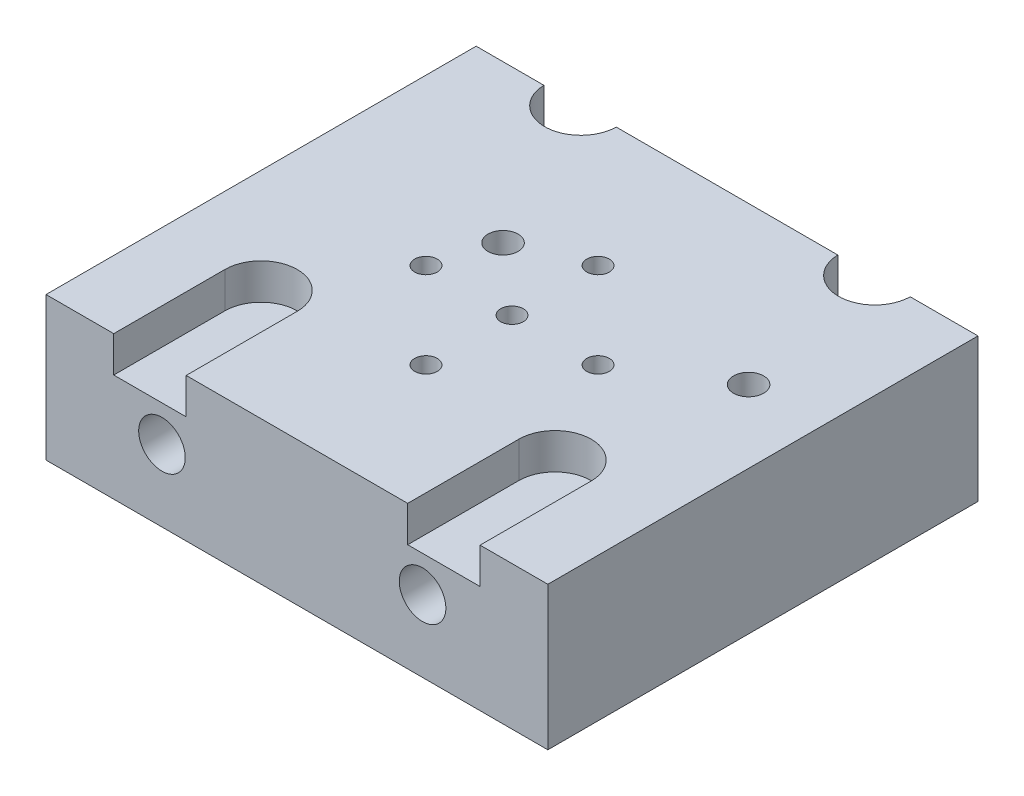
ISO-10303-21;
HEADER;
FILE_DESCRIPTION(('STEP AP214'),'2;1');
FILE_NAME('part.step','',(''),(''),'','','');
FILE_SCHEMA(('AUTOMOTIVE_DESIGN { 1 0 10303 214 1 1 1 1 }'));
ENDSEC;
DATA;
#1=APPLICATION_CONTEXT('core data for automotive mechanical design processes');
#2=APPLICATION_PROTOCOL_DEFINITION('international standard','automotive_design',2000,#1);
#3=PRODUCT_CONTEXT('',#1,'mechanical');
#4=PRODUCT('Part','Part','',(#3));
#5=PRODUCT_RELATED_PRODUCT_CATEGORY('part','',(#4));
#6=PRODUCT_DEFINITION_FORMATION('','',#4);
#7=PRODUCT_DEFINITION_CONTEXT('part definition',#1,'design');
#8=PRODUCT_DEFINITION('design','',#6,#7);
#9=PRODUCT_DEFINITION_SHAPE('','',#8);
#10=(LENGTH_UNIT() NAMED_UNIT(*) SI_UNIT(.MILLI.,.METRE.));
#11=(NAMED_UNIT(*) PLANE_ANGLE_UNIT() SI_UNIT($,.RADIAN.));
#12=(NAMED_UNIT(*) SI_UNIT($,.STERADIAN.) SOLID_ANGLE_UNIT());
#13=UNCERTAINTY_MEASURE_WITH_UNIT(LENGTH_MEASURE(1.E-05),#10,'distance_accuracy_value','');
#14=(GEOMETRIC_REPRESENTATION_CONTEXT(3) GLOBAL_UNCERTAINTY_ASSIGNED_CONTEXT((#13)) GLOBAL_UNIT_ASSIGNED_CONTEXT((#10,
#11,#12)) REPRESENTATION_CONTEXT('',''));
#15=CARTESIAN_POINT('',(0.,0.,0.));
#16=DIRECTION('',(0.,0.,1.));
#17=DIRECTION('',(1.,0.,0.));
#18=AXIS2_PLACEMENT_3D('',#15,#16,#17);
#19=CARTESIAN_POINT('',(35.,0.,30.));
#20=DIRECTION('',(0.,1.,0.));
#21=DIRECTION('',(0.,0.,1.));
#22=AXIS2_PLACEMENT_3D('',#19,#20,#21);
#23=CYLINDRICAL_SURFACE('',#22,1.575);
#24=CARTESIAN_POINT('',(35.,20.,30.));
#25=DIRECTION('',(0.,1.,0.));
#26=DIRECTION('',(0.,0.,1.));
#27=AXIS2_PLACEMENT_3D('',#24,#25,#26);
#28=CIRCLE('',#27,1.575);
#29=CARTESIAN_POINT('',(35.,20.,31.575));
#30=VERTEX_POINT('',#29);
#31=EDGE_CURVE('E296',#30,#30,#28,.T.);
#32=ORIENTED_EDGE('',*,*,#31,.T.);
#33=EDGE_LOOP('',(#32));
#34=FACE_BOUND('',#33,.T.);
#35=CARTESIAN_POINT('',(35.,3.,30.));
#36=DIRECTION('',(0.,-1.,0.));
#37=DIRECTION('',(0.,0.,-1.));
#38=AXIS2_PLACEMENT_3D('',#35,#36,#37);
#39=CIRCLE('',#38,1.575);
#40=CARTESIAN_POINT('',(35.,3.,28.425));
#41=VERTEX_POINT('',#40);
#42=EDGE_CURVE('E274',#41,#41,#39,.F.);
#43=ORIENTED_EDGE('',*,*,#42,.F.);
#44=EDGE_LOOP('',(#43));
#45=FACE_BOUND('',#44,.T.);
#46=ADVANCED_FACE('F47',(#34,#45),#23,.F.);
#47=CARTESIAN_POINT('',(23.,0.,30.));
#48=DIRECTION('',(0.,1.,0.));
#49=DIRECTION('',(0.,0.,1.));
#50=AXIS2_PLACEMENT_3D('',#47,#48,#49);
#51=CYLINDRICAL_SURFACE('',#50,1.575);
#52=CARTESIAN_POINT('',(23.,20.,30.));
#53=DIRECTION('',(0.,1.,0.));
#54=DIRECTION('',(0.,0.,1.));
#55=AXIS2_PLACEMENT_3D('',#52,#53,#54);
#56=CIRCLE('',#55,1.575);
#57=CARTESIAN_POINT('',(23.,20.,31.575));
#58=VERTEX_POINT('',#57);
#59=EDGE_CURVE('E278',#58,#58,#56,.T.);
#60=ORIENTED_EDGE('',*,*,#59,.T.);
#61=EDGE_LOOP('',(#60));
#62=FACE_BOUND('',#61,.T.);
#63=CARTESIAN_POINT('',(23.,3.,30.));
#64=DIRECTION('',(0.,-1.,0.));
#65=DIRECTION('',(0.,0.,-1.));
#66=AXIS2_PLACEMENT_3D('',#63,#64,#65);
#67=CIRCLE('',#66,1.575);
#68=CARTESIAN_POINT('',(23.,3.,28.425));
#69=VERTEX_POINT('',#68);
#70=EDGE_CURVE('E345',#69,#69,#67,.F.);
#71=ORIENTED_EDGE('',*,*,#70,.F.);
#72=EDGE_LOOP('',(#71));
#73=FACE_BOUND('',#72,.T.);
#74=ADVANCED_FACE('F424',(#62,#73),#51,.F.);
#75=CARTESIAN_POINT('',(35.,0.,42.));
#76=DIRECTION('',(0.,1.,0.));
#77=DIRECTION('',(0.,0.,1.));
#78=AXIS2_PLACEMENT_3D('',#75,#76,#77);
#79=CYLINDRICAL_SURFACE('',#78,1.57499999999999);
#80=CARTESIAN_POINT('',(35.,20.,42.));
#81=DIRECTION('',(0.,1.,0.));
#82=DIRECTION('',(0.,0.,1.));
#83=AXIS2_PLACEMENT_3D('',#80,#81,#82);
#84=CIRCLE('',#83,1.57499999999999);
#85=CARTESIAN_POINT('',(35.,20.,43.575));
#86=VERTEX_POINT('',#85);
#87=EDGE_CURVE('E287',#86,#86,#84,.T.);
#88=ORIENTED_EDGE('',*,*,#87,.T.);
#89=EDGE_LOOP('',(#88));
#90=FACE_BOUND('',#89,.T.);
#91=CARTESIAN_POINT('',(35.,3.,42.));
#92=DIRECTION('',(0.,-1.,0.));
#93=DIRECTION('',(0.,0.,-1.));
#94=AXIS2_PLACEMENT_3D('',#91,#92,#93);
#95=CIRCLE('',#94,1.57499999999999);
#96=CARTESIAN_POINT('',(35.,3.,40.425));
#97=VERTEX_POINT('',#96);
#98=EDGE_CURVE('E342',#97,#97,#95,.F.);
#99=ORIENTED_EDGE('',*,*,#98,.F.);
#100=EDGE_LOOP('',(#99));
#101=FACE_BOUND('',#100,.T.);
#102=ADVANCED_FACE('F431',(#90,#101),#79,.F.);
#103=CARTESIAN_POINT('',(47.,0.,30.));
#104=DIRECTION('',(0.,1.,0.));
#105=DIRECTION('',(0.,0.,1.));
#106=AXIS2_PLACEMENT_3D('',#103,#104,#105);
#107=CYLINDRICAL_SURFACE('',#106,1.575);
#108=CARTESIAN_POINT('',(47.,20.,30.));
#109=DIRECTION('',(0.,1.,0.));
#110=DIRECTION('',(0.,0.,1.));
#111=AXIS2_PLACEMENT_3D('',#108,#109,#110);
#112=CIRCLE('',#111,1.575);
#113=CARTESIAN_POINT('',(47.,20.,31.575));
#114=VERTEX_POINT('',#113);
#115=EDGE_CURVE('E290',#114,#114,#112,.T.);
#116=ORIENTED_EDGE('',*,*,#115,.T.);
#117=EDGE_LOOP('',(#116));
#118=FACE_BOUND('',#117,.T.);
#119=CARTESIAN_POINT('',(47.,3.,30.));
#120=DIRECTION('',(0.,-1.,0.));
#121=DIRECTION('',(0.,0.,-1.));
#122=AXIS2_PLACEMENT_3D('',#119,#120,#121);
#123=CIRCLE('',#122,1.575);
#124=CARTESIAN_POINT('',(47.,3.,28.425));
#125=VERTEX_POINT('',#124);
#126=EDGE_CURVE('E339',#125,#125,#123,.F.);
#127=ORIENTED_EDGE('',*,*,#126,.F.);
#128=EDGE_LOOP('',(#127));
#129=FACE_BOUND('',#128,.T.);
#130=ADVANCED_FACE('F437',(#118,#129),#107,.F.);
#131=CARTESIAN_POINT('',(35.,0.,18.));
#132=DIRECTION('',(0.,1.,0.));
#133=DIRECTION('',(0.,0.,1.));
#134=AXIS2_PLACEMENT_3D('',#131,#132,#133);
#135=CYLINDRICAL_SURFACE('',#134,1.575);
#136=CARTESIAN_POINT('',(35.,20.,18.));
#137=DIRECTION('',(0.,1.,0.));
#138=DIRECTION('',(0.,0.,1.));
#139=AXIS2_PLACEMENT_3D('',#136,#137,#138);
#140=CIRCLE('',#139,1.575);
#141=CARTESIAN_POINT('',(35.,20.,19.575));
#142=VERTEX_POINT('',#141);
#143=EDGE_CURVE('E293',#142,#142,#140,.T.);
#144=ORIENTED_EDGE('',*,*,#143,.T.);
#145=EDGE_LOOP('',(#144));
#146=FACE_BOUND('',#145,.T.);
#147=CARTESIAN_POINT('',(35.,3.,18.));
#148=DIRECTION('',(0.,-1.,0.));
#149=DIRECTION('',(0.,0.,-1.));
#150=AXIS2_PLACEMENT_3D('',#147,#148,#149);
#151=CIRCLE('',#150,1.575);
#152=CARTESIAN_POINT('',(35.,3.,16.425));
#153=VERTEX_POINT('',#152);
#154=EDGE_CURVE('E240',#153,#153,#151,.F.);
#155=ORIENTED_EDGE('',*,*,#154,.F.);
#156=EDGE_LOOP('',(#155));
#157=FACE_BOUND('',#156,.T.);
#158=ADVANCED_FACE('F455',(#146,#157),#135,.F.);
#159=CARTESIAN_POINT('',(0.,20.,0.));
#160=DIRECTION('',(1.,0.,0.));
#161=DIRECTION('',(0.,0.,-1.));
#162=AXIS2_PLACEMENT_3D('',#159,#160,#161);
#163=PLANE('',#162);
#164=DIRECTION('',(0.,0.,1.));
#165=VECTOR('',#164,1.);
#166=CARTESIAN_POINT('',(0.,0.,0.));
#167=LINE('',#166,#165);
#168=CARTESIAN_POINT('',(0.,0.,0.));
#169=VERTEX_POINT('',#168);
#170=CARTESIAN_POINT('',(0.,0.,60.));
#171=VERTEX_POINT('',#170);
#172=EDGE_CURVE('E301',#169,#171,#167,.T.);
#173=ORIENTED_EDGE('',*,*,#172,.T.);
#174=DIRECTION('',(0.,-1.,0.));
#175=VECTOR('',#174,1.);
#176=CARTESIAN_POINT('',(0.,20.,60.));
#177=LINE('',#176,#175);
#178=CARTESIAN_POINT('',(0.,20.,60.));
#179=VERTEX_POINT('',#178);
#180=EDGE_CURVE('E333',#179,#171,#177,.T.);
#181=ORIENTED_EDGE('',*,*,#180,.F.);
#182=DIRECTION('',(0.,0.,1.));
#183=VECTOR('',#182,1.);
#184=CARTESIAN_POINT('',(0.,20.,0.));
#185=LINE('',#184,#183);
#186=CARTESIAN_POINT('',(0.,20.,0.));
#187=VERTEX_POINT('',#186);
#188=EDGE_CURVE('E302',#187,#179,#185,.T.);
#189=ORIENTED_EDGE('',*,*,#188,.F.);
#190=DIRECTION('',(0.,-1.,0.));
#191=VECTOR('',#190,1.);
#192=CARTESIAN_POINT('',(0.,20.,0.));
#193=LINE('',#192,#191);
#194=EDGE_CURVE('E316',#187,#169,#193,.T.);
#195=ORIENTED_EDGE('',*,*,#194,.T.);
#196=EDGE_LOOP('',(#173,#181,#189,#195));
#197=FACE_BOUND('',#196,.T.);
#198=ADVANCED_FACE('F404',(#197),#163,.F.);
#199=CARTESIAN_POINT('',(0.,20.,60.));
#200=DIRECTION('',(0.,0.,-1.));
#201=DIRECTION('',(-1.,0.,0.));
#202=AXIS2_PLACEMENT_3D('',#199,#200,#201);
#203=PLANE('',#202);
#204=CARTESIAN_POINT('',(52.525,10.,60.));
#205=DIRECTION('',(0.,0.,-1.));
#206=DIRECTION('',(-1.,0.,0.));
#207=AXIS2_PLACEMENT_3D('',#204,#205,#206);
#208=CIRCLE('',#207,3.25);
#209=CARTESIAN_POINT('',(49.275,10.,60.));
#210=VERTEX_POINT('',#209);
#211=EDGE_CURVE('E267',#210,#210,#208,.T.);
#212=ORIENTED_EDGE('',*,*,#211,.T.);
#213=EDGE_LOOP('',(#212));
#214=FACE_BOUND('',#213,.T.);
#215=CARTESIAN_POINT('',(16.175,10.,60.));
#216=DIRECTION('',(0.,0.,-1.));
#217=DIRECTION('',(-1.,0.,0.));
#218=AXIS2_PLACEMENT_3D('',#215,#216,#217);
#219=CIRCLE('',#218,3.25);
#220=CARTESIAN_POINT('',(12.925,10.,60.));
#221=VERTEX_POINT('',#220);
#222=EDGE_CURVE('E271',#221,#221,#219,.T.);
#223=ORIENTED_EDGE('',*,*,#222,.T.);
#224=EDGE_LOOP('',(#223));
#225=FACE_BOUND('',#224,.T.);
#226=DIRECTION('',(-1.,0.,0.));
#227=VECTOR('',#226,1.);
#228=CARTESIAN_POINT('',(0.,15.,60.));
#229=LINE('',#228,#227);
#230=CARTESIAN_POINT('',(60.55,15.,60.));
#231=VERTEX_POINT('',#230);
#232=CARTESIAN_POINT('',(50.45,15.,60.));
#233=VERTEX_POINT('',#232);
#234=EDGE_CURVE('E12',#231,#233,#229,.T.);
#235=ORIENTED_EDGE('',*,*,#234,.T.);
#236=DIRECTION('',(0.,1.,0.));
#237=VECTOR('',#236,1.);
#238=CARTESIAN_POINT('',(50.45,20.,60.));
#239=LINE('',#238,#237);
#240=CARTESIAN_POINT('',(50.45,20.,60.));
#241=VERTEX_POINT('',#240);
#242=EDGE_CURVE('E230',#233,#241,#239,.T.);
#243=ORIENTED_EDGE('',*,*,#242,.T.);
#244=DIRECTION('',(1.,0.,0.));
#245=VECTOR('',#244,1.);
#246=CARTESIAN_POINT('',(0.,20.,60.));
#247=LINE('',#246,#245);
#248=CARTESIAN_POINT('',(19.55,20.,60.));
#249=VERTEX_POINT('',#248);
#250=EDGE_CURVE('E190',#249,#241,#247,.T.);
#251=ORIENTED_EDGE('',*,*,#250,.F.);
#252=DIRECTION('',(0.,-1.,0.));
#253=VECTOR('',#252,1.);
#254=CARTESIAN_POINT('',(19.55,20.,60.));
#255=LINE('',#254,#253);
#256=CARTESIAN_POINT('',(19.55,15.,60.));
#257=VERTEX_POINT('',#256);
#258=EDGE_CURVE('E215',#249,#257,#255,.T.);
#259=ORIENTED_EDGE('',*,*,#258,.T.);
#260=DIRECTION('',(1.,0.,0.));
#261=VECTOR('',#260,1.);
#262=CARTESIAN_POINT('',(0.,15.,60.));
#263=LINE('',#262,#261);
#264=CARTESIAN_POINT('',(9.45000000000001,15.,60.));
#265=VERTEX_POINT('',#264);
#266=EDGE_CURVE('E56',#265,#257,#263,.T.);
#267=ORIENTED_EDGE('',*,*,#266,.F.);
#268=DIRECTION('',(0.,1.,0.));
#269=VECTOR('',#268,1.);
#270=CARTESIAN_POINT('',(9.45000000000001,20.,60.));
#271=LINE('',#270,#269);
#272=CARTESIAN_POINT('',(9.45000000000001,20.,60.));
#273=VERTEX_POINT('',#272);
#274=EDGE_CURVE('E220',#265,#273,#271,.T.);
#275=ORIENTED_EDGE('',*,*,#274,.T.);
#276=EDGE_CURVE('E307',#179,#273,#247,.T.);
#277=ORIENTED_EDGE('',*,*,#276,.F.);
#278=ORIENTED_EDGE('',*,*,#180,.T.);
#279=DIRECTION('',(1.,0.,0.));
#280=VECTOR('',#279,1.);
#281=CARTESIAN_POINT('',(0.,0.,60.));
#282=LINE('',#281,#280);
#283=CARTESIAN_POINT('',(70.,0.,60.));
#284=VERTEX_POINT('',#283);
#285=EDGE_CURVE('E320',#171,#284,#282,.T.);
#286=ORIENTED_EDGE('',*,*,#285,.T.);
#287=DIRECTION('',(0.,-1.,0.));
#288=VECTOR('',#287,1.);
#289=CARTESIAN_POINT('',(70.,20.,60.));
#290=LINE('',#289,#288);
#291=CARTESIAN_POINT('',(70.,20.,60.));
#292=VERTEX_POINT('',#291);
#293=EDGE_CURVE('E330',#292,#284,#290,.T.);
#294=ORIENTED_EDGE('',*,*,#293,.F.);
#295=CARTESIAN_POINT('',(60.55,20.,60.));
#296=VERTEX_POINT('',#295);
#297=EDGE_CURVE('E305',#296,#292,#247,.T.);
#298=ORIENTED_EDGE('',*,*,#297,.F.);
#299=DIRECTION('',(0.,-1.,0.));
#300=VECTOR('',#299,1.);
#301=CARTESIAN_POINT('',(60.55,20.,60.));
#302=LINE('',#301,#300);
#303=EDGE_CURVE('E227',#296,#231,#302,.T.);
#304=ORIENTED_EDGE('',*,*,#303,.T.);
#305=EDGE_LOOP('',(#235,#243,#251,#259,#267,#275,#277,#278,#286,#294,#298,#304));
#306=FACE_BOUND('',#305,.T.);
#307=ADVANCED_FACE('F381',(#214,#225,#306),#203,.F.);
#308=CARTESIAN_POINT('',(70.,20.,0.));
#309=DIRECTION('',(-1.,0.,0.));
#310=DIRECTION('',(0.,0.,1.));
#311=AXIS2_PLACEMENT_3D('',#308,#309,#310);
#312=PLANE('',#311);
#313=DIRECTION('',(0.,0.,-1.));
#314=VECTOR('',#313,1.);
#315=CARTESIAN_POINT('',(70.,0.,0.));
#316=LINE('',#315,#314);
#317=CARTESIAN_POINT('',(70.,0.,0.));
#318=VERTEX_POINT('',#317);
#319=EDGE_CURVE('E322',#284,#318,#316,.T.);
#320=ORIENTED_EDGE('',*,*,#319,.T.);
#321=DIRECTION('',(0.,-1.,0.));
#322=VECTOR('',#321,1.);
#323=CARTESIAN_POINT('',(70.,20.,0.));
#324=LINE('',#323,#322);
#325=CARTESIAN_POINT('',(70.,20.,0.));
#326=VERTEX_POINT('',#325);
#327=EDGE_CURVE('E327',#326,#318,#324,.T.);
#328=ORIENTED_EDGE('',*,*,#327,.F.);
#329=DIRECTION('',(0.,0.,-1.));
#330=VECTOR('',#329,1.);
#331=CARTESIAN_POINT('',(70.,20.,0.));
#332=LINE('',#331,#330);
#333=EDGE_CURVE('E310',#292,#326,#332,.T.);
#334=ORIENTED_EDGE('',*,*,#333,.F.);
#335=ORIENTED_EDGE('',*,*,#293,.T.);
#336=EDGE_LOOP('',(#320,#328,#334,#335));
#337=FACE_BOUND('',#336,.T.);
#338=ADVANCED_FACE('F388',(#337),#312,.F.);
#339=CARTESIAN_POINT('',(0.,20.,0.));
#340=DIRECTION('',(0.,0.,1.));
#341=DIRECTION('',(1.,0.,0.));
#342=AXIS2_PLACEMENT_3D('',#339,#340,#341);
#343=PLANE('',#342);
#344=CARTESIAN_POINT('',(52.525,10.,0.));
#345=DIRECTION('',(0.,0.,1.));
#346=DIRECTION('',(1.,0.,0.));
#347=AXIS2_PLACEMENT_3D('',#344,#345,#346);
#348=CIRCLE('',#347,4.05);
#349=CARTESIAN_POINT('',(56.575,10.,0.));
#350=VERTEX_POINT('',#349);
#351=EDGE_CURVE('E355',#350,#350,#348,.T.);
#352=ORIENTED_EDGE('',*,*,#351,.T.);
#353=EDGE_LOOP('',(#352));
#354=FACE_BOUND('',#353,.T.);
#355=CARTESIAN_POINT('',(16.175,10.,0.));
#356=DIRECTION('',(0.,0.,1.));
#357=DIRECTION('',(1.,0.,0.));
#358=AXIS2_PLACEMENT_3D('',#355,#356,#357);
#359=CIRCLE('',#358,4.05);
#360=CARTESIAN_POINT('',(20.225,10.,0.));
#361=VERTEX_POINT('',#360);
#362=EDGE_CURVE('E352',#361,#361,#359,.T.);
#363=ORIENTED_EDGE('',*,*,#362,.T.);
#364=EDGE_LOOP('',(#363));
#365=FACE_BOUND('',#364,.T.);
#366=DIRECTION('',(-1.,0.,0.));
#367=VECTOR('',#366,1.);
#368=CARTESIAN_POINT('',(0.,15.,0.));
#369=LINE('',#368,#367);
#370=CARTESIAN_POINT('',(19.5489093426721,15.,0.));
#371=VERTEX_POINT('',#370);
#372=CARTESIAN_POINT('',(9.45109065732797,15.,0.));
#373=VERTEX_POINT('',#372);
#374=EDGE_CURVE('E370',#371,#373,#369,.T.);
#375=ORIENTED_EDGE('',*,*,#374,.F.);
#376=DIRECTION('',(0.,1.,0.));
#377=VECTOR('',#376,1.);
#378=CARTESIAN_POINT('',(19.5489093426721,15.,0.));
#379=LINE('',#378,#377);
#380=CARTESIAN_POINT('',(19.5489093426721,20.,0.));
#381=VERTEX_POINT('',#380);
#382=EDGE_CURVE('E233',#371,#381,#379,.T.);
#383=ORIENTED_EDGE('',*,*,#382,.T.);
#384=DIRECTION('',(-1.,0.,0.));
#385=VECTOR('',#384,1.);
#386=CARTESIAN_POINT('',(0.,20.,0.));
#387=LINE('',#386,#385);
#388=CARTESIAN_POINT('',(50.451090657328,20.,0.));
#389=VERTEX_POINT('',#388);
#390=EDGE_CURVE('E317',#389,#381,#387,.T.);
#391=ORIENTED_EDGE('',*,*,#390,.F.);
#392=DIRECTION('',(0.,1.,0.));
#393=VECTOR('',#392,1.);
#394=CARTESIAN_POINT('',(50.451090657328,15.,0.));
#395=LINE('',#394,#393);
#396=CARTESIAN_POINT('',(50.451090657328,15.,0.));
#397=VERTEX_POINT('',#396);
#398=EDGE_CURVE('E71',#389,#397,#395,.F.);
#399=ORIENTED_EDGE('',*,*,#398,.T.);
#400=DIRECTION('',(1.,0.,0.));
#401=VECTOR('',#400,1.);
#402=CARTESIAN_POINT('',(0.,15.,0.));
#403=LINE('',#402,#401);
#404=CARTESIAN_POINT('',(60.548909342672,15.,0.));
#405=VERTEX_POINT('',#404);
#406=EDGE_CURVE('E367',#397,#405,#403,.T.);
#407=ORIENTED_EDGE('',*,*,#406,.T.);
#408=DIRECTION('',(0.,1.,0.));
#409=VECTOR('',#408,1.);
#410=CARTESIAN_POINT('',(60.548909342672,15.,0.));
#411=LINE('',#410,#409);
#412=CARTESIAN_POINT('',(60.548909342672,20.,0.));
#413=VERTEX_POINT('',#412);
#414=EDGE_CURVE('E224',#405,#413,#411,.T.);
#415=ORIENTED_EDGE('',*,*,#414,.T.);
#416=EDGE_CURVE('E313',#326,#413,#387,.T.);
#417=ORIENTED_EDGE('',*,*,#416,.F.);
#418=ORIENTED_EDGE('',*,*,#327,.T.);
#419=DIRECTION('',(-1.,0.,0.));
#420=VECTOR('',#419,1.);
#421=CARTESIAN_POINT('',(0.,0.,0.));
#422=LINE('',#421,#420);
#423=EDGE_CURVE('E306',#318,#169,#422,.T.);
#424=ORIENTED_EDGE('',*,*,#423,.T.);
#425=ORIENTED_EDGE('',*,*,#194,.F.);
#426=CARTESIAN_POINT('',(9.45109065732797,20.,0.));
#427=VERTEX_POINT('',#426);
#428=EDGE_CURVE('E312',#427,#187,#387,.T.);
#429=ORIENTED_EDGE('',*,*,#428,.F.);
#430=DIRECTION('',(0.,1.,0.));
#431=VECTOR('',#430,1.);
#432=CARTESIAN_POINT('',(9.45109065732797,15.,0.));
#433=LINE('',#432,#431);
#434=EDGE_CURVE('E63',#427,#373,#433,.F.);
#435=ORIENTED_EDGE('',*,*,#434,.T.);
#436=EDGE_LOOP('',(#375,#383,#391,#399,#407,#415,#417,#418,#424,#425,#429,#435));
#437=FACE_BOUND('',#436,.T.);
#438=ADVANCED_FACE('F393',(#354,#365,#437),#343,.F.);
#439=CARTESIAN_POINT('',(0.,20.,0.));
#440=DIRECTION('',(0.,1.,0.));
#441=DIRECTION('',(0.,0.,1.));
#442=AXIS2_PLACEMENT_3D('',#439,#440,#441);
#443=PLANE('',#442);
#444=CARTESIAN_POINT('',(14.5,20.,-0.104949747398012));
#445=DIRECTION('',(0.,1.,0.));
#446=DIRECTION('',(0.,0.,1.));
#447=AXIS2_PLACEMENT_3D('',#444,#445,#446);
#448=CIRCLE('',#447,5.05);
#449=EDGE_CURVE('E365',#427,#381,#448,.T.);
#450=ORIENTED_EDGE('',*,*,#449,.F.);
#451=ORIENTED_EDGE('',*,*,#428,.T.);
#452=ORIENTED_EDGE('',*,*,#188,.T.);
#453=ORIENTED_EDGE('',*,*,#276,.T.);
#454=DIRECTION('',(0.,0.,1.));
#455=VECTOR('',#454,1.);
#456=CARTESIAN_POINT('',(9.45000000000001,20.,60.104949747398));
#457=LINE('',#456,#455);
#458=CARTESIAN_POINT('',(9.45000000000001,20.,44.5));
#459=VERTEX_POINT('',#458);
#460=EDGE_CURVE('E202',#459,#273,#457,.T.);
#461=ORIENTED_EDGE('',*,*,#460,.F.);
#462=CARTESIAN_POINT('',(14.5,20.,44.5));
#463=DIRECTION('',(0.,1.,0.));
#464=DIRECTION('',(0.,0.,1.));
#465=AXIS2_PLACEMENT_3D('',#462,#463,#464);
#466=CIRCLE('',#465,5.05);
#467=CARTESIAN_POINT('',(19.55,20.,44.5));
#468=VERTEX_POINT('',#467);
#469=EDGE_CURVE('E209',#468,#459,#466,.T.);
#470=ORIENTED_EDGE('',*,*,#469,.F.);
#471=DIRECTION('',(0.,0.,-1.));
#472=VECTOR('',#471,1.);
#473=CARTESIAN_POINT('',(19.5500000000001,20.,0.));
#474=LINE('',#473,#472);
#475=EDGE_CURVE('E361',#249,#468,#474,.T.);
#476=ORIENTED_EDGE('',*,*,#475,.F.);
#477=ORIENTED_EDGE('',*,*,#250,.T.);
#478=DIRECTION('',(0.,0.,1.));
#479=VECTOR('',#478,1.);
#480=CARTESIAN_POINT('',(50.45,20.,60.104949747398));
#481=LINE('',#480,#479);
#482=CARTESIAN_POINT('',(50.45,20.,44.5));
#483=VERTEX_POINT('',#482);
#484=EDGE_CURVE('E166',#483,#241,#481,.T.);
#485=ORIENTED_EDGE('',*,*,#484,.F.);
#486=CARTESIAN_POINT('',(55.5,20.,44.5));
#487=DIRECTION('',(0.,1.,0.));
#488=DIRECTION('',(0.,0.,-1.));
#489=AXIS2_PLACEMENT_3D('',#486,#487,#488);
#490=CIRCLE('',#489,5.05);
#491=CARTESIAN_POINT('',(60.55,20.,44.5));
#492=VERTEX_POINT('',#491);
#493=EDGE_CURVE('E178',#492,#483,#490,.T.);
#494=ORIENTED_EDGE('',*,*,#493,.F.);
#495=DIRECTION('',(0.,0.,-1.));
#496=VECTOR('',#495,1.);
#497=CARTESIAN_POINT('',(60.55,20.,0.));
#498=LINE('',#497,#496);
#499=EDGE_CURVE('E363',#296,#492,#498,.T.);
#500=ORIENTED_EDGE('',*,*,#499,.F.);
#501=ORIENTED_EDGE('',*,*,#297,.T.);
#502=ORIENTED_EDGE('',*,*,#333,.T.);
#503=ORIENTED_EDGE('',*,*,#416,.T.);
#504=CARTESIAN_POINT('',(55.5,20.,-0.104949747398012));
#505=DIRECTION('',(0.,1.,0.));
#506=DIRECTION('',(0.,0.,-1.));
#507=AXIS2_PLACEMENT_3D('',#504,#505,#506);
#508=CIRCLE('',#507,5.04999999999999);
#509=EDGE_CURVE('E174',#389,#413,#508,.T.);
#510=ORIENTED_EDGE('',*,*,#509,.F.);
#511=ORIENTED_EDGE('',*,*,#390,.T.);
#512=EDGE_LOOP('',(#450,#451,#452,#453,#461,#470,#476,#477,#485,#494,#500,#501,#502,#503,#510,#511));
#513=FACE_BOUND('',#512,.T.);
#514=CARTESIAN_POINT('',(59.875,20.,21.875));
#515=DIRECTION('',(0.,-1.,0.));
#516=DIRECTION('',(0.,0.,-1.));
#517=AXIS2_PLACEMENT_3D('',#514,#515,#516);
#518=CIRCLE('',#517,2.1);
#519=CARTESIAN_POINT('',(59.875,20.,19.775));
#520=VERTEX_POINT('',#519);
#521=EDGE_CURVE('E275',#520,#520,#518,.T.);
#522=ORIENTED_EDGE('',*,*,#521,.T.);
#523=EDGE_LOOP('',(#522));
#524=FACE_BOUND('',#523,.T.);
#525=CARTESIAN_POINT('',(25.625,20.,21.875));
#526=DIRECTION('',(0.,-1.,0.));
#527=DIRECTION('',(0.,0.,-1.));
#528=AXIS2_PLACEMENT_3D('',#525,#526,#527);
#529=CIRCLE('',#528,2.09999999999999);
#530=CARTESIAN_POINT('',(25.625,20.,19.775));
#531=VERTEX_POINT('',#530);
#532=EDGE_CURVE('E270',#531,#531,#529,.T.);
#533=ORIENTED_EDGE('',*,*,#532,.T.);
#534=EDGE_LOOP('',(#533));
#535=FACE_BOUND('',#534,.T.);
#536=ORIENTED_EDGE('',*,*,#143,.F.);
#537=EDGE_LOOP('',(#536));
#538=FACE_BOUND('',#537,.T.);
#539=ORIENTED_EDGE('',*,*,#115,.F.);
#540=EDGE_LOOP('',(#539));
#541=FACE_BOUND('',#540,.T.);
#542=ORIENTED_EDGE('',*,*,#87,.F.);
#543=EDGE_LOOP('',(#542));
#544=FACE_BOUND('',#543,.T.);
#545=ORIENTED_EDGE('',*,*,#59,.F.);
#546=EDGE_LOOP('',(#545));
#547=FACE_BOUND('',#546,.T.);
#548=ORIENTED_EDGE('',*,*,#31,.F.);
#549=EDGE_LOOP('',(#548));
#550=FACE_BOUND('',#549,.T.);
#551=ADVANCED_FACE('F186',(#513,#524,#535,#538,#541,#544,#547,#550),#443,.T.);
#552=CARTESIAN_POINT('',(0.,0.,0.));
#553=DIRECTION('',(0.,1.,0.));
#554=DIRECTION('',(0.,0.,1.));
#555=AXIS2_PLACEMENT_3D('',#552,#553,#554);
#556=PLANE('',#555);
#557=CARTESIAN_POINT('',(35.,0.,42.));
#558=DIRECTION('',(0.,-1.,0.));
#559=DIRECTION('',(0.,0.,-1.));
#560=AXIS2_PLACEMENT_3D('',#557,#558,#559);
#561=CIRCLE('',#560,2.99999999999999);
#562=CARTESIAN_POINT('',(35.,0.,39.));
#563=VERTEX_POINT('',#562);
#564=EDGE_CURVE('E241',#563,#563,#561,.T.);
#565=ORIENTED_EDGE('',*,*,#564,.F.);
#566=EDGE_LOOP('',(#565));
#567=FACE_BOUND('',#566,.T.);
#568=CARTESIAN_POINT('',(35.,0.,18.));
#569=DIRECTION('',(0.,-1.,0.));
#570=DIRECTION('',(0.,0.,-1.));
#571=AXIS2_PLACEMENT_3D('',#568,#569,#570);
#572=CIRCLE('',#571,2.99999999999999);
#573=CARTESIAN_POINT('',(35.,0.,15.));
#574=VERTEX_POINT('',#573);
#575=EDGE_CURVE('E252',#574,#574,#572,.T.);
#576=ORIENTED_EDGE('',*,*,#575,.F.);
#577=EDGE_LOOP('',(#576));
#578=FACE_BOUND('',#577,.T.);
#579=CARTESIAN_POINT('',(47.,0.,30.));
#580=DIRECTION('',(0.,-1.,0.));
#581=DIRECTION('',(0.,0.,-1.));
#582=AXIS2_PLACEMENT_3D('',#579,#580,#581);
#583=CIRCLE('',#582,2.99999999999999);
#584=CARTESIAN_POINT('',(47.,0.,27.));
#585=VERTEX_POINT('',#584);
#586=EDGE_CURVE('E245',#585,#585,#583,.T.);
#587=ORIENTED_EDGE('',*,*,#586,.F.);
#588=EDGE_LOOP('',(#587));
#589=FACE_BOUND('',#588,.T.);
#590=CARTESIAN_POINT('',(35.,0.,30.));
#591=DIRECTION('',(0.,-1.,0.));
#592=DIRECTION('',(0.,0.,-1.));
#593=AXIS2_PLACEMENT_3D('',#590,#591,#592);
#594=CIRCLE('',#593,2.99999999999999);
#595=CARTESIAN_POINT('',(35.,0.,27.));
#596=VERTEX_POINT('',#595);
#597=EDGE_CURVE('E262',#596,#596,#594,.T.);
#598=ORIENTED_EDGE('',*,*,#597,.F.);
#599=EDGE_LOOP('',(#598));
#600=FACE_BOUND('',#599,.T.);
#601=CARTESIAN_POINT('',(23.,0.,30.));
#602=DIRECTION('',(0.,-1.,0.));
#603=DIRECTION('',(0.,0.,-1.));
#604=AXIS2_PLACEMENT_3D('',#601,#602,#603);
#605=CIRCLE('',#604,3.);
#606=CARTESIAN_POINT('',(23.,0.,27.));
#607=VERTEX_POINT('',#606);
#608=EDGE_CURVE('E244',#607,#607,#605,.T.);
#609=ORIENTED_EDGE('',*,*,#608,.F.);
#610=EDGE_LOOP('',(#609));
#611=FACE_BOUND('',#610,.T.);
#612=CARTESIAN_POINT('',(59.875,0.,21.875));
#613=DIRECTION('',(0.,-1.,0.));
#614=DIRECTION('',(0.,0.,-1.));
#615=AXIS2_PLACEMENT_3D('',#612,#613,#614);
#616=CIRCLE('',#615,2.1);
#617=CARTESIAN_POINT('',(59.875,0.,19.775));
#618=VERTEX_POINT('',#617);
#619=EDGE_CURVE('E279',#618,#618,#616,.T.);
#620=ORIENTED_EDGE('',*,*,#619,.F.);
#621=EDGE_LOOP('',(#620));
#622=FACE_BOUND('',#621,.T.);
#623=CARTESIAN_POINT('',(25.625,0.,21.875));
#624=DIRECTION('',(0.,-1.,0.));
#625=DIRECTION('',(0.,0.,-1.));
#626=AXIS2_PLACEMENT_3D('',#623,#624,#625);
#627=CIRCLE('',#626,2.09999999999999);
#628=CARTESIAN_POINT('',(25.625,0.,19.775));
#629=VERTEX_POINT('',#628);
#630=EDGE_CURVE('E282',#629,#629,#627,.T.);
#631=ORIENTED_EDGE('',*,*,#630,.F.);
#632=EDGE_LOOP('',(#631));
#633=FACE_BOUND('',#632,.T.);
#634=ORIENTED_EDGE('',*,*,#172,.F.);
#635=ORIENTED_EDGE('',*,*,#423,.F.);
#636=ORIENTED_EDGE('',*,*,#319,.F.);
#637=ORIENTED_EDGE('',*,*,#285,.F.);
#638=EDGE_LOOP('',(#634,#635,#636,#637));
#639=FACE_BOUND('',#638,.T.);
#640=ADVANCED_FACE('F441',(#567,#578,#589,#600,#611,#622,#633,#639),#556,.F.);
#641=CARTESIAN_POINT('',(25.625,20.,21.875));
#642=DIRECTION('',(0.,-1.,0.));
#643=DIRECTION('',(0.,0.,-1.));
#644=AXIS2_PLACEMENT_3D('',#641,#642,#643);
#645=CYLINDRICAL_SURFACE('',#644,2.09999999999999);
#646=ORIENTED_EDGE('',*,*,#532,.F.);
#647=EDGE_LOOP('',(#646));
#648=FACE_BOUND('',#647,.T.);
#649=ORIENTED_EDGE('',*,*,#630,.T.);
#650=EDGE_LOOP('',(#649));
#651=FACE_BOUND('',#650,.T.);
#652=ADVANCED_FACE('F444',(#648,#651),#645,.F.);
#653=CARTESIAN_POINT('',(59.875,20.,21.875));
#654=DIRECTION('',(0.,-1.,0.));
#655=DIRECTION('',(0.,0.,-1.));
#656=AXIS2_PLACEMENT_3D('',#653,#654,#655);
#657=CYLINDRICAL_SURFACE('',#656,2.1);
#658=ORIENTED_EDGE('',*,*,#521,.F.);
#659=EDGE_LOOP('',(#658));
#660=FACE_BOUND('',#659,.T.);
#661=ORIENTED_EDGE('',*,*,#619,.T.);
#662=EDGE_LOOP('',(#661));
#663=FACE_BOUND('',#662,.T.);
#664=ADVANCED_FACE('F486',(#660,#663),#657,.F.);
#665=CARTESIAN_POINT('',(16.175,10.,60.));
#666=DIRECTION('',(0.,0.,-1.));
#667=DIRECTION('',(-1.,0.,0.));
#668=AXIS2_PLACEMENT_3D('',#665,#666,#667);
#669=CYLINDRICAL_SURFACE('',#668,3.25);
#670=CARTESIAN_POINT('',(16.175,10.,0.800000000000002));
#671=DIRECTION('',(0.,0.,1.));
#672=DIRECTION('',(1.,0.,0.));
#673=AXIS2_PLACEMENT_3D('',#670,#671,#672);
#674=CIRCLE('',#673,3.25);
#675=CARTESIAN_POINT('',(19.425,10.,0.800000000000002));
#676=VERTEX_POINT('',#675);
#677=EDGE_CURVE('E358',#676,#676,#674,.F.);
#678=ORIENTED_EDGE('',*,*,#677,.T.);
#679=EDGE_LOOP('',(#678));
#680=FACE_BOUND('',#679,.T.);
#681=ORIENTED_EDGE('',*,*,#222,.F.);
#682=EDGE_LOOP('',(#681));
#683=FACE_BOUND('',#682,.T.);
#684=ADVANCED_FACE('F479',(#680,#683),#669,.F.);
#685=CARTESIAN_POINT('',(52.525,10.,60.));
#686=DIRECTION('',(0.,0.,-1.));
#687=DIRECTION('',(-1.,0.,0.));
#688=AXIS2_PLACEMENT_3D('',#685,#686,#687);
#689=CYLINDRICAL_SURFACE('',#688,3.25);
#690=CARTESIAN_POINT('',(52.525,10.,0.800000000000009));
#691=DIRECTION('',(0.,0.,1.));
#692=DIRECTION('',(1.,0.,0.));
#693=AXIS2_PLACEMENT_3D('',#690,#691,#692);
#694=CIRCLE('',#693,3.25);
#695=CARTESIAN_POINT('',(55.775,10.,0.800000000000009));
#696=VERTEX_POINT('',#695);
#697=EDGE_CURVE('E336',#696,#696,#694,.F.);
#698=ORIENTED_EDGE('',*,*,#697,.T.);
#699=EDGE_LOOP('',(#698));
#700=FACE_BOUND('',#699,.T.);
#701=ORIENTED_EDGE('',*,*,#211,.F.);
#702=EDGE_LOOP('',(#701));
#703=FACE_BOUND('',#702,.T.);
#704=ADVANCED_FACE('F476',(#700,#703),#689,.F.);
#705=CARTESIAN_POINT('',(0.,3.,0.));
#706=DIRECTION('',(0.,-1.,0.));
#707=DIRECTION('',(0.,0.,-1.));
#708=AXIS2_PLACEMENT_3D('',#705,#706,#707);
#709=PLANE('',#708);
#710=CARTESIAN_POINT('',(35.,3.,18.));
#711=DIRECTION('',(0.,-1.,0.));
#712=DIRECTION('',(0.,0.,-1.));
#713=AXIS2_PLACEMENT_3D('',#710,#711,#712);
#714=CIRCLE('',#713,2.99999999999999);
#715=CARTESIAN_POINT('',(35.,3.,15.));
#716=VERTEX_POINT('',#715);
#717=EDGE_CURVE('E236',#716,#716,#714,.T.);
#718=ORIENTED_EDGE('',*,*,#717,.T.);
#719=EDGE_LOOP('',(#718));
#720=FACE_BOUND('',#719,.T.);
#721=ORIENTED_EDGE('',*,*,#154,.T.);
#722=EDGE_LOOP('',(#721));
#723=FACE_BOUND('',#722,.T.);
#724=ADVANCED_FACE('F478',(#720,#723),#709,.T.);
#725=CARTESIAN_POINT('',(35.,3.,18.));
#726=DIRECTION('',(0.,-1.,0.));
#727=DIRECTION('',(0.,0.,-1.));
#728=AXIS2_PLACEMENT_3D('',#725,#726,#727);
#729=CYLINDRICAL_SURFACE('',#728,2.99999999999999);
#730=ORIENTED_EDGE('',*,*,#717,.F.);
#731=EDGE_LOOP('',(#730));
#732=FACE_BOUND('',#731,.T.);
#733=ORIENTED_EDGE('',*,*,#575,.T.);
#734=EDGE_LOOP('',(#733));
#735=FACE_BOUND('',#734,.T.);
#736=ADVANCED_FACE('F511',(#732,#735),#729,.F.);
#737=CARTESIAN_POINT('',(0.,3.,0.));
#738=DIRECTION('',(0.,-1.,0.));
#739=DIRECTION('',(0.,0.,-1.));
#740=AXIS2_PLACEMENT_3D('',#737,#738,#739);
#741=PLANE('',#740);
#742=CARTESIAN_POINT('',(47.,3.,30.));
#743=DIRECTION('',(0.,-1.,0.));
#744=DIRECTION('',(0.,0.,-1.));
#745=AXIS2_PLACEMENT_3D('',#742,#743,#744);
#746=CIRCLE('',#745,2.99999999999999);
#747=CARTESIAN_POINT('',(47.,3.,27.));
#748=VERTEX_POINT('',#747);
#749=EDGE_CURVE('E249',#748,#748,#746,.T.);
#750=ORIENTED_EDGE('',*,*,#749,.T.);
#751=EDGE_LOOP('',(#750));
#752=FACE_BOUND('',#751,.T.);
#753=ORIENTED_EDGE('',*,*,#126,.T.);
#754=EDGE_LOOP('',(#753));
#755=FACE_BOUND('',#754,.T.);
#756=ADVANCED_FACE('F517',(#752,#755),#741,.T.);
#757=CARTESIAN_POINT('',(47.,3.,30.));
#758=DIRECTION('',(0.,-1.,0.));
#759=DIRECTION('',(0.,0.,-1.));
#760=AXIS2_PLACEMENT_3D('',#757,#758,#759);
#761=CYLINDRICAL_SURFACE('',#760,2.99999999999999);
#762=ORIENTED_EDGE('',*,*,#749,.F.);
#763=EDGE_LOOP('',(#762));
#764=FACE_BOUND('',#763,.T.);
#765=ORIENTED_EDGE('',*,*,#586,.T.);
#766=EDGE_LOOP('',(#765));
#767=FACE_BOUND('',#766,.T.);
#768=ADVANCED_FACE('F761',(#764,#767),#761,.F.);
#769=CARTESIAN_POINT('',(0.,3.,0.));
#770=DIRECTION('',(0.,-1.,0.));
#771=DIRECTION('',(0.,0.,-1.));
#772=AXIS2_PLACEMENT_3D('',#769,#770,#771);
#773=PLANE('',#772);
#774=CARTESIAN_POINT('',(35.,3.,42.));
#775=DIRECTION('',(0.,-1.,0.));
#776=DIRECTION('',(0.,0.,-1.));
#777=AXIS2_PLACEMENT_3D('',#774,#775,#776);
#778=CIRCLE('',#777,2.99999999999999);
#779=CARTESIAN_POINT('',(35.,3.,39.));
#780=VERTEX_POINT('',#779);
#781=EDGE_CURVE('E237',#780,#780,#778,.T.);
#782=ORIENTED_EDGE('',*,*,#781,.T.);
#783=EDGE_LOOP('',(#782));
#784=FACE_BOUND('',#783,.T.);
#785=ORIENTED_EDGE('',*,*,#98,.T.);
#786=EDGE_LOOP('',(#785));
#787=FACE_BOUND('',#786,.T.);
#788=ADVANCED_FACE('F770',(#784,#787),#773,.T.);
#789=CARTESIAN_POINT('',(35.,3.,42.));
#790=DIRECTION('',(0.,-1.,0.));
#791=DIRECTION('',(0.,0.,-1.));
#792=AXIS2_PLACEMENT_3D('',#789,#790,#791);
#793=CYLINDRICAL_SURFACE('',#792,2.99999999999999);
#794=ORIENTED_EDGE('',*,*,#781,.F.);
#795=EDGE_LOOP('',(#794));
#796=FACE_BOUND('',#795,.T.);
#797=ORIENTED_EDGE('',*,*,#564,.T.);
#798=EDGE_LOOP('',(#797));
#799=FACE_BOUND('',#798,.T.);
#800=ADVANCED_FACE('F528',(#796,#799),#793,.F.);
#801=CARTESIAN_POINT('',(0.,3.,0.));
#802=DIRECTION('',(0.,-1.,0.));
#803=DIRECTION('',(0.,0.,-1.));
#804=AXIS2_PLACEMENT_3D('',#801,#802,#803);
#805=PLANE('',#804);
#806=CARTESIAN_POINT('',(23.,3.,30.));
#807=DIRECTION('',(0.,-1.,0.));
#808=DIRECTION('',(0.,0.,-1.));
#809=AXIS2_PLACEMENT_3D('',#806,#807,#808);
#810=CIRCLE('',#809,3.);
#811=CARTESIAN_POINT('',(23.,3.,27.));
#812=VERTEX_POINT('',#811);
#813=EDGE_CURVE('E259',#812,#812,#810,.T.);
#814=ORIENTED_EDGE('',*,*,#813,.T.);
#815=EDGE_LOOP('',(#814));
#816=FACE_BOUND('',#815,.T.);
#817=ORIENTED_EDGE('',*,*,#70,.T.);
#818=EDGE_LOOP('',(#817));
#819=FACE_BOUND('',#818,.T.);
#820=ADVANCED_FACE('F525',(#816,#819),#805,.T.);
#821=CARTESIAN_POINT('',(23.,3.,30.));
#822=DIRECTION('',(0.,-1.,0.));
#823=DIRECTION('',(0.,0.,-1.));
#824=AXIS2_PLACEMENT_3D('',#821,#822,#823);
#825=CYLINDRICAL_SURFACE('',#824,3.);
#826=ORIENTED_EDGE('',*,*,#813,.F.);
#827=EDGE_LOOP('',(#826));
#828=FACE_BOUND('',#827,.T.);
#829=ORIENTED_EDGE('',*,*,#608,.T.);
#830=EDGE_LOOP('',(#829));
#831=FACE_BOUND('',#830,.T.);
#832=ADVANCED_FACE('F522',(#828,#831),#825,.F.);
#833=CARTESIAN_POINT('',(0.,3.,0.));
#834=DIRECTION('',(0.,-1.,0.));
#835=DIRECTION('',(0.,0.,-1.));
#836=AXIS2_PLACEMENT_3D('',#833,#834,#835);
#837=PLANE('',#836);
#838=CARTESIAN_POINT('',(35.,3.,30.));
#839=DIRECTION('',(0.,-1.,0.));
#840=DIRECTION('',(0.,0.,-1.));
#841=AXIS2_PLACEMENT_3D('',#838,#839,#840);
#842=CIRCLE('',#841,2.99999999999999);
#843=CARTESIAN_POINT('',(35.,3.,27.));
#844=VERTEX_POINT('',#843);
#845=EDGE_CURVE('E248',#844,#844,#842,.T.);
#846=ORIENTED_EDGE('',*,*,#845,.T.);
#847=EDGE_LOOP('',(#846));
#848=FACE_BOUND('',#847,.T.);
#849=ORIENTED_EDGE('',*,*,#42,.T.);
#850=EDGE_LOOP('',(#849));
#851=FACE_BOUND('',#850,.T.);
#852=ADVANCED_FACE('F469',(#848,#851),#837,.T.);
#853=CARTESIAN_POINT('',(35.,3.,30.));
#854=DIRECTION('',(0.,-1.,0.));
#855=DIRECTION('',(0.,0.,-1.));
#856=AXIS2_PLACEMENT_3D('',#853,#854,#855);
#857=CYLINDRICAL_SURFACE('',#856,2.99999999999999);
#858=ORIENTED_EDGE('',*,*,#845,.F.);
#859=EDGE_LOOP('',(#858));
#860=FACE_BOUND('',#859,.T.);
#861=ORIENTED_EDGE('',*,*,#597,.T.);
#862=EDGE_LOOP('',(#861));
#863=FACE_BOUND('',#862,.T.);
#864=ADVANCED_FACE('F461',(#860,#863),#857,.F.);
#865=CARTESIAN_POINT('',(52.525,10.,0.800000000000009));
#866=DIRECTION('',(0.,0.,-1.));
#867=DIRECTION('',(-1.,0.,0.));
#868=AXIS2_PLACEMENT_3D('',#865,#866,#867);
#869=CONICAL_SURFACE('',#868,3.25,0.785398163397441);
#870=ORIENTED_EDGE('',*,*,#351,.F.);
#871=EDGE_LOOP('',(#870));
#872=FACE_BOUND('',#871,.T.);
#873=ORIENTED_EDGE('',*,*,#697,.F.);
#874=EDGE_LOOP('',(#873));
#875=FACE_BOUND('',#874,.T.);
#876=ADVANCED_FACE('F457',(#872,#875),#869,.F.);
#877=CARTESIAN_POINT('',(16.175,10.,0.800000000000002));
#878=DIRECTION('',(0.,0.,-1.));
#879=DIRECTION('',(-1.,0.,0.));
#880=AXIS2_PLACEMENT_3D('',#877,#878,#879);
#881=CONICAL_SURFACE('',#880,3.25,0.785398163397443);
#882=ORIENTED_EDGE('',*,*,#362,.F.);
#883=EDGE_LOOP('',(#882));
#884=FACE_BOUND('',#883,.T.);
#885=ORIENTED_EDGE('',*,*,#677,.F.);
#886=EDGE_LOOP('',(#885));
#887=FACE_BOUND('',#886,.T.);
#888=ADVANCED_FACE('F50',(#884,#887),#881,.F.);
#889=CARTESIAN_POINT('',(14.5,15.,60.104949747398));
#890=DIRECTION('',(0.,1.,0.));
#891=DIRECTION('',(0.,0.,1.));
#892=AXIS2_PLACEMENT_3D('',#889,#890,#891);
#893=PLANE('',#892);
#894=ORIENTED_EDGE('',*,*,#266,.T.);
#895=DIRECTION('',(0.,0.,-1.));
#896=VECTOR('',#895,1.);
#897=CARTESIAN_POINT('',(19.55,15.,60.104949747398));
#898=LINE('',#897,#896);
#899=CARTESIAN_POINT('',(19.55,15.,44.5));
#900=VERTEX_POINT('',#899);
#901=EDGE_CURVE('E199',#257,#900,#898,.T.);
#902=ORIENTED_EDGE('',*,*,#901,.T.);
#903=CARTESIAN_POINT('',(14.5,15.,44.5));
#904=DIRECTION('',(0.,1.,0.));
#905=DIRECTION('',(0.,0.,1.));
#906=AXIS2_PLACEMENT_3D('',#903,#904,#905);
#907=CIRCLE('',#906,5.05);
#908=CARTESIAN_POINT('',(9.45000000000001,15.,44.5));
#909=VERTEX_POINT('',#908);
#910=EDGE_CURVE('E201',#900,#909,#907,.T.);
#911=ORIENTED_EDGE('',*,*,#910,.T.);
#912=DIRECTION('',(0.,0.,1.));
#913=VECTOR('',#912,1.);
#914=CARTESIAN_POINT('',(9.45000000000001,15.,60.104949747398));
#915=LINE('',#914,#913);
#916=EDGE_CURVE('E205',#909,#265,#915,.T.);
#917=ORIENTED_EDGE('',*,*,#916,.T.);
#918=EDGE_LOOP('',(#894,#902,#911,#917));
#919=FACE_BOUND('',#918,.T.);
#920=ADVANCED_FACE('F374',(#919),#893,.T.);
#921=CARTESIAN_POINT('',(9.45000000000001,15.,60.104949747398));
#922=DIRECTION('',(-1.,0.,0.));
#923=DIRECTION('',(0.,0.,1.));
#924=AXIS2_PLACEMENT_3D('',#921,#922,#923);
#925=PLANE('',#924);
#926=ORIENTED_EDGE('',*,*,#916,.F.);
#927=DIRECTION('',(0.,1.,0.));
#928=VECTOR('',#927,1.);
#929=CARTESIAN_POINT('',(9.45000000000001,15.,44.5));
#930=LINE('',#929,#928);
#931=EDGE_CURVE('E213',#909,#459,#930,.T.);
#932=ORIENTED_EDGE('',*,*,#931,.T.);
#933=ORIENTED_EDGE('',*,*,#460,.T.);
#934=ORIENTED_EDGE('',*,*,#274,.F.);
#935=EDGE_LOOP('',(#926,#932,#933,#934));
#936=FACE_BOUND('',#935,.T.);
#937=ADVANCED_FACE('F408',(#936),#925,.F.);
#938=CARTESIAN_POINT('',(19.55,15.,60.104949747398));
#939=DIRECTION('',(1.,0.,0.));
#940=DIRECTION('',(0.,0.,-1.));
#941=AXIS2_PLACEMENT_3D('',#938,#939,#940);
#942=PLANE('',#941);
#943=ORIENTED_EDGE('',*,*,#475,.T.);
#944=DIRECTION('',(0.,1.,0.));
#945=VECTOR('',#944,1.);
#946=CARTESIAN_POINT('',(19.55,15.,44.5));
#947=LINE('',#946,#945);
#948=EDGE_CURVE('E208',#900,#468,#947,.T.);
#949=ORIENTED_EDGE('',*,*,#948,.F.);
#950=ORIENTED_EDGE('',*,*,#901,.F.);
#951=ORIENTED_EDGE('',*,*,#258,.F.);
#952=EDGE_LOOP('',(#943,#949,#950,#951));
#953=FACE_BOUND('',#952,.T.);
#954=ADVANCED_FACE('F379',(#953),#942,.F.);
#955=CARTESIAN_POINT('',(14.5,15.,44.5));
#956=DIRECTION('',(0.,1.,0.));
#957=DIRECTION('',(0.,0.,1.));
#958=AXIS2_PLACEMENT_3D('',#955,#956,#957);
#959=CYLINDRICAL_SURFACE('',#958,5.05);
#960=ORIENTED_EDGE('',*,*,#469,.T.);
#961=ORIENTED_EDGE('',*,*,#931,.F.);
#962=ORIENTED_EDGE('',*,*,#910,.F.);
#963=ORIENTED_EDGE('',*,*,#948,.T.);
#964=EDGE_LOOP('',(#960,#961,#962,#963));
#965=FACE_BOUND('',#964,.T.);
#966=ADVANCED_FACE('F410',(#965),#959,.F.);
#967=CARTESIAN_POINT('',(55.5,15.,-0.104949747398012));
#968=DIRECTION('',(0.,-1.,0.));
#969=DIRECTION('',(0.,0.,-1.));
#970=AXIS2_PLACEMENT_3D('',#967,#968,#969);
#971=PLANE('',#970);
#972=CARTESIAN_POINT('',(55.5,15.,-0.104949747398012));
#973=DIRECTION('',(0.,1.,0.));
#974=DIRECTION('',(0.,0.,-1.));
#975=AXIS2_PLACEMENT_3D('',#972,#973,#974);
#976=CIRCLE('',#975,5.04999999999999);
#977=EDGE_CURVE('E396',#397,#405,#976,.T.);
#978=ORIENTED_EDGE('',*,*,#977,.T.);
#979=ORIENTED_EDGE('',*,*,#406,.F.);
#980=EDGE_LOOP('',(#978,#979));
#981=FACE_BOUND('',#980,.T.);
#982=ADVANCED_FACE('F412',(#981),#971,.F.);
#983=CARTESIAN_POINT('',(55.5,15.,-0.104949747398012));
#984=DIRECTION('',(0.,1.,0.));
#985=DIRECTION('',(0.,0.,1.));
#986=AXIS2_PLACEMENT_3D('',#983,#984,#985);
#987=CYLINDRICAL_SURFACE('',#986,5.04999999999999);
#988=ORIENTED_EDGE('',*,*,#977,.F.);
#989=ORIENTED_EDGE('',*,*,#398,.F.);
#990=ORIENTED_EDGE('',*,*,#509,.T.);
#991=ORIENTED_EDGE('',*,*,#414,.F.);
#992=EDGE_LOOP('',(#988,#989,#990,#991));
#993=FACE_BOUND('',#992,.T.);
#994=ADVANCED_FACE('F418',(#993),#987,.F.);
#995=CARTESIAN_POINT('',(55.5,15.,60.104949747398));
#996=DIRECTION('',(0.,-1.,0.));
#997=DIRECTION('',(0.,0.,-1.));
#998=AXIS2_PLACEMENT_3D('',#995,#996,#997);
#999=PLANE('',#998);
#1000=DIRECTION('',(0.,0.,-1.));
#1001=VECTOR('',#1000,1.);
#1002=CARTESIAN_POINT('',(60.55,15.,60.104949747398));
#1003=LINE('',#1002,#1001);
#1004=CARTESIAN_POINT('',(60.55,15.,44.5));
#1005=VERTEX_POINT('',#1004);
#1006=EDGE_CURVE('E191',#231,#1005,#1003,.T.);
#1007=ORIENTED_EDGE('',*,*,#1006,.T.);
#1008=CARTESIAN_POINT('',(55.5,15.,44.5));
#1009=DIRECTION('',(0.,1.,0.));
#1010=DIRECTION('',(0.,0.,-1.));
#1011=AXIS2_PLACEMENT_3D('',#1008,#1009,#1010);
#1012=CIRCLE('',#1011,5.05);
#1013=CARTESIAN_POINT('',(50.45,15.,44.5));
#1014=VERTEX_POINT('',#1013);
#1015=EDGE_CURVE('E193',#1005,#1014,#1012,.T.);
#1016=ORIENTED_EDGE('',*,*,#1015,.T.);
#1017=DIRECTION('',(0.,0.,1.));
#1018=VECTOR('',#1017,1.);
#1019=CARTESIAN_POINT('',(50.45,15.,60.104949747398));
#1020=LINE('',#1019,#1018);
#1021=EDGE_CURVE('E169',#1014,#233,#1020,.T.);
#1022=ORIENTED_EDGE('',*,*,#1021,.T.);
#1023=ORIENTED_EDGE('',*,*,#234,.F.);
#1024=EDGE_LOOP('',(#1007,#1016,#1022,#1023));
#1025=FACE_BOUND('',#1024,.T.);
#1026=ADVANCED_FACE('F608',(#1025),#999,.F.);
#1027=CARTESIAN_POINT('',(50.45,15.,60.104949747398));
#1028=DIRECTION('',(-1.,0.,0.));
#1029=DIRECTION('',(0.,0.,1.));
#1030=AXIS2_PLACEMENT_3D('',#1027,#1028,#1029);
#1031=PLANE('',#1030);
#1032=ORIENTED_EDGE('',*,*,#1021,.F.);
#1033=DIRECTION('',(0.,1.,0.));
#1034=VECTOR('',#1033,1.);
#1035=CARTESIAN_POINT('',(50.45,15.,44.5));
#1036=LINE('',#1035,#1034);
#1037=EDGE_CURVE('E162',#1014,#483,#1036,.T.);
#1038=ORIENTED_EDGE('',*,*,#1037,.T.);
#1039=ORIENTED_EDGE('',*,*,#484,.T.);
#1040=ORIENTED_EDGE('',*,*,#242,.F.);
#1041=EDGE_LOOP('',(#1032,#1038,#1039,#1040));
#1042=FACE_BOUND('',#1041,.T.);
#1043=ADVANCED_FACE('F164',(#1042),#1031,.F.);
#1044=CARTESIAN_POINT('',(60.55,15.,60.104949747398));
#1045=DIRECTION('',(1.,0.,0.));
#1046=DIRECTION('',(0.,0.,-1.));
#1047=AXIS2_PLACEMENT_3D('',#1044,#1045,#1046);
#1048=PLANE('',#1047);
#1049=ORIENTED_EDGE('',*,*,#499,.T.);
#1050=DIRECTION('',(0.,1.,0.));
#1051=VECTOR('',#1050,1.);
#1052=CARTESIAN_POINT('',(60.55,15.,44.5));
#1053=LINE('',#1052,#1051);
#1054=EDGE_CURVE('E173',#1005,#492,#1053,.T.);
#1055=ORIENTED_EDGE('',*,*,#1054,.F.);
#1056=ORIENTED_EDGE('',*,*,#1006,.F.);
#1057=ORIENTED_EDGE('',*,*,#303,.F.);
#1058=EDGE_LOOP('',(#1049,#1055,#1056,#1057));
#1059=FACE_BOUND('',#1058,.T.);
#1060=ADVANCED_FACE('F626',(#1059),#1048,.F.);
#1061=CARTESIAN_POINT('',(55.5,15.,44.5));
#1062=DIRECTION('',(0.,1.,0.));
#1063=DIRECTION('',(0.,0.,1.));
#1064=AXIS2_PLACEMENT_3D('',#1061,#1062,#1063);
#1065=CYLINDRICAL_SURFACE('',#1064,5.05);
#1066=ORIENTED_EDGE('',*,*,#493,.T.);
#1067=ORIENTED_EDGE('',*,*,#1037,.F.);
#1068=ORIENTED_EDGE('',*,*,#1015,.F.);
#1069=ORIENTED_EDGE('',*,*,#1054,.T.);
#1070=EDGE_LOOP('',(#1066,#1067,#1068,#1069));
#1071=FACE_BOUND('',#1070,.T.);
#1072=ADVANCED_FACE('F179',(#1071),#1065,.F.);
#1073=CARTESIAN_POINT('',(14.5,15.,-0.104949747398012));
#1074=DIRECTION('',(0.,1.,0.));
#1075=DIRECTION('',(0.,0.,1.));
#1076=AXIS2_PLACEMENT_3D('',#1073,#1074,#1075);
#1077=PLANE('',#1076);
#1078=ORIENTED_EDGE('',*,*,#374,.T.);
#1079=CARTESIAN_POINT('',(14.5,15.,-0.104949747398012));
#1080=DIRECTION('',(0.,1.,0.));
#1081=DIRECTION('',(0.,0.,1.));
#1082=AXIS2_PLACEMENT_3D('',#1079,#1080,#1081);
#1083=CIRCLE('',#1082,5.05);
#1084=EDGE_CURVE('E183',#373,#371,#1083,.T.);
#1085=ORIENTED_EDGE('',*,*,#1084,.T.);
#1086=EDGE_LOOP('',(#1078,#1085));
#1087=FACE_BOUND('',#1086,.T.);
#1088=ADVANCED_FACE('F644',(#1087),#1077,.T.);
#1089=CARTESIAN_POINT('',(14.5,15.,-0.104949747398012));
#1090=DIRECTION('',(0.,1.,0.));
#1091=DIRECTION('',(0.,0.,1.));
#1092=AXIS2_PLACEMENT_3D('',#1089,#1090,#1091);
#1093=CYLINDRICAL_SURFACE('',#1092,5.05);
#1094=ORIENTED_EDGE('',*,*,#1084,.F.);
#1095=ORIENTED_EDGE('',*,*,#434,.F.);
#1096=ORIENTED_EDGE('',*,*,#449,.T.);
#1097=ORIENTED_EDGE('',*,*,#382,.F.);
#1098=EDGE_LOOP('',(#1094,#1095,#1096,#1097));
#1099=FACE_BOUND('',#1098,.T.);
#1100=ADVANCED_FACE('F653',(#1099),#1093,.F.);
#1101=CLOSED_SHELL('',(#46,#74,#102,#130,#158,#198,#307,#338,#438,#551,#640,#652,#664,#684,#704,
#724,#736,#756,#768,#788,#800,#820,#832,#852,#864,#876,#888,#920,#937,#954,#966,#982,#994,#1026,
#1043,#1060,#1072,#1088,#1100));
#1102=MANIFOLD_SOLID_BREP('B2',#1101);
#1103=ADVANCED_BREP_SHAPE_REPRESENTATION('',(#18,#1102),#14);
#1104=SHAPE_DEFINITION_REPRESENTATION(#9,#1103);
ENDSEC;
END-ISO-10303-21;
